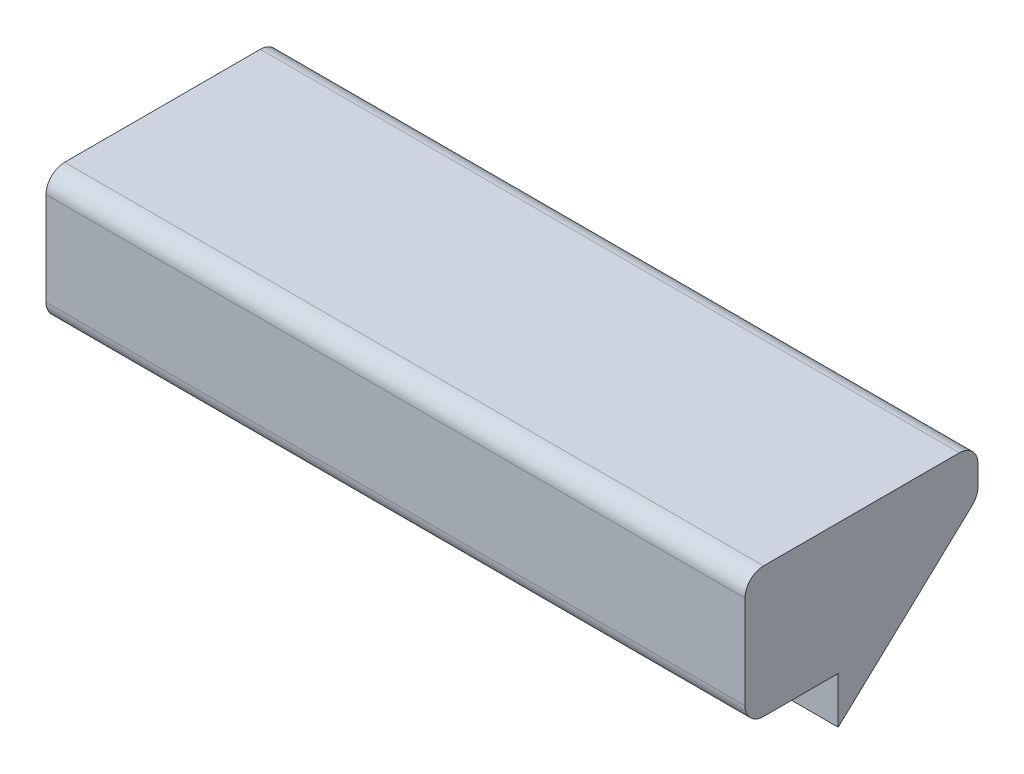
ISO-10303-21;
HEADER;
FILE_DESCRIPTION(('STEP AP214'),'2;1');
FILE_NAME('part.step','',(''),(''),'','','');
FILE_SCHEMA(('AUTOMOTIVE_DESIGN { 1 0 10303 214 1 1 1 1 }'));
ENDSEC;
DATA;
#1=APPLICATION_CONTEXT('core data for automotive mechanical design processes');
#2=APPLICATION_PROTOCOL_DEFINITION('international standard','automotive_design',2000,#1);
#3=PRODUCT_CONTEXT('',#1,'mechanical');
#4=PRODUCT('Part','Part','',(#3));
#5=PRODUCT_RELATED_PRODUCT_CATEGORY('part','',(#4));
#6=PRODUCT_DEFINITION_FORMATION('','',#4);
#7=PRODUCT_DEFINITION_CONTEXT('part definition',#1,'design');
#8=PRODUCT_DEFINITION('design','',#6,#7);
#9=PRODUCT_DEFINITION_SHAPE('','',#8);
#10=(LENGTH_UNIT() NAMED_UNIT(*) SI_UNIT(.MILLI.,.METRE.));
#11=(NAMED_UNIT(*) PLANE_ANGLE_UNIT() SI_UNIT($,.RADIAN.));
#12=(NAMED_UNIT(*) SI_UNIT($,.STERADIAN.) SOLID_ANGLE_UNIT());
#13=UNCERTAINTY_MEASURE_WITH_UNIT(LENGTH_MEASURE(1.E-05),#10,'distance_accuracy_value','');
#14=(GEOMETRIC_REPRESENTATION_CONTEXT(3) GLOBAL_UNCERTAINTY_ASSIGNED_CONTEXT((#13)) GLOBAL_UNIT_ASSIGNED_CONTEXT((#10,
#11,#12)) REPRESENTATION_CONTEXT('',''));
#15=CARTESIAN_POINT('',(0.,0.,0.));
#16=DIRECTION('',(0.,0.,1.));
#17=DIRECTION('',(1.,0.,0.));
#18=AXIS2_PLACEMENT_3D('',#15,#16,#17);
#19=CARTESIAN_POINT('',(75.,0.,-25.));
#20=DIRECTION('',(0.,-1.,0.));
#21=DIRECTION('',(0.,0.,-1.));
#22=AXIS2_PLACEMENT_3D('',#19,#20,#21);
#23=PLANE('',#22);
#24=DIRECTION('',(0.,0.,1.));
#25=VECTOR('',#24,1.);
#26=CARTESIAN_POINT('',(0.,0.,-25.));
#27=LINE('',#26,#25);
#28=CARTESIAN_POINT('',(0.,0.,-23.));
#29=VERTEX_POINT('',#28);
#30=CARTESIAN_POINT('',(0.,0.,-2.));
#31=VERTEX_POINT('',#30);
#32=EDGE_CURVE('E146',#29,#31,#27,.T.);
#33=ORIENTED_EDGE('',*,*,#32,.T.);
#34=DIRECTION('',(-1.,0.,0.));
#35=VECTOR('',#34,1.);
#36=CARTESIAN_POINT('',(75.,0.,-2.));
#37=LINE('',#36,#35);
#38=CARTESIAN_POINT('',(75.,0.,-2.));
#39=VERTEX_POINT('',#38);
#40=EDGE_CURVE('E177',#31,#39,#37,.F.);
#41=ORIENTED_EDGE('',*,*,#40,.T.);
#42=DIRECTION('',(0.,0.,1.));
#43=VECTOR('',#42,1.);
#44=CARTESIAN_POINT('',(75.,0.,-25.));
#45=LINE('',#44,#43);
#46=CARTESIAN_POINT('',(75.,0.,-23.));
#47=VERTEX_POINT('',#46);
#48=EDGE_CURVE('E160',#47,#39,#45,.T.);
#49=ORIENTED_EDGE('',*,*,#48,.F.);
#50=DIRECTION('',(-1.,0.,0.));
#51=VECTOR('',#50,1.);
#52=CARTESIAN_POINT('',(75.,0.,-23.));
#53=LINE('',#52,#51);
#54=EDGE_CURVE('E174',#47,#29,#53,.T.);
#55=ORIENTED_EDGE('',*,*,#54,.T.);
#56=EDGE_LOOP('',(#33,#41,#49,#55));
#57=FACE_BOUND('',#56,.T.);
#58=ADVANCED_FACE('F35',(#57),#23,.F.);
#59=CARTESIAN_POINT('',(75.,0.,0.));
#60=DIRECTION('',(0.,0.,-1.));
#61=DIRECTION('',(0.,1.,0.));
#62=AXIS2_PLACEMENT_3D('',#59,#60,#61);
#63=PLANE('',#62);
#64=DIRECTION('',(0.,-1.,0.));
#65=VECTOR('',#64,1.);
#66=CARTESIAN_POINT('',(75.,0.,0.));
#67=LINE('',#66,#65);
#68=CARTESIAN_POINT('',(75.,-2.,0.));
#69=VERTEX_POINT('',#68);
#70=CARTESIAN_POINT('',(75.,-12.,0.));
#71=VERTEX_POINT('',#70);
#72=EDGE_CURVE('E124',#69,#71,#67,.T.);
#73=ORIENTED_EDGE('',*,*,#72,.F.);
#74=DIRECTION('',(-1.,0.,0.));
#75=VECTOR('',#74,1.);
#76=CARTESIAN_POINT('',(75.,-2.,0.));
#77=LINE('',#76,#75);
#78=CARTESIAN_POINT('',(0.,-2.,0.));
#79=VERTEX_POINT('',#78);
#80=EDGE_CURVE('E163',#69,#79,#77,.T.);
#81=ORIENTED_EDGE('',*,*,#80,.T.);
#82=DIRECTION('',(0.,-1.,0.));
#83=VECTOR('',#82,1.);
#84=CARTESIAN_POINT('',(0.,0.,0.));
#85=LINE('',#84,#83);
#86=CARTESIAN_POINT('',(0.,-12.,0.));
#87=VERTEX_POINT('',#86);
#88=EDGE_CURVE('E149',#79,#87,#85,.T.);
#89=ORIENTED_EDGE('',*,*,#88,.T.);
#90=DIRECTION('',(-1.,0.,0.));
#91=VECTOR('',#90,1.);
#92=CARTESIAN_POINT('',(75.,-12.,0.));
#93=LINE('',#92,#91);
#94=EDGE_CURVE('E133',#87,#71,#93,.F.);
#95=ORIENTED_EDGE('',*,*,#94,.T.);
#96=EDGE_LOOP('',(#73,#81,#89,#95));
#97=FACE_BOUND('',#96,.T.);
#98=ADVANCED_FACE('F223',(#97),#63,.F.);
#99=CARTESIAN_POINT('',(75.,-14.,0.));
#100=DIRECTION('',(0.,1.,0.));
#101=DIRECTION('',(0.,0.,1.));
#102=AXIS2_PLACEMENT_3D('',#99,#100,#101);
#103=PLANE('',#102);
#104=DIRECTION('',(0.,0.,-1.));
#105=VECTOR('',#104,1.);
#106=CARTESIAN_POINT('',(75.,-14.,0.));
#107=LINE('',#106,#105);
#108=CARTESIAN_POINT('',(75.,-14.,-2.));
#109=VERTEX_POINT('',#108);
#110=CARTESIAN_POINT('',(75.,-14.,-10.));
#111=VERTEX_POINT('',#110);
#112=EDGE_CURVE('E111',#109,#111,#107,.T.);
#113=ORIENTED_EDGE('',*,*,#112,.F.);
#114=DIRECTION('',(-1.,0.,0.));
#115=VECTOR('',#114,1.);
#116=CARTESIAN_POINT('',(75.,-14.,-2.));
#117=LINE('',#116,#115);
#118=CARTESIAN_POINT('',(0.,-14.,-2.));
#119=VERTEX_POINT('',#118);
#120=EDGE_CURVE('E185',#109,#119,#117,.T.);
#121=ORIENTED_EDGE('',*,*,#120,.T.);
#122=DIRECTION('',(0.,0.,-1.));
#123=VECTOR('',#122,1.);
#124=CARTESIAN_POINT('',(0.,-14.,0.));
#125=LINE('',#124,#123);
#126=CARTESIAN_POINT('',(0.,-14.,-10.));
#127=VERTEX_POINT('',#126);
#128=EDGE_CURVE('E130',#119,#127,#125,.T.);
#129=ORIENTED_EDGE('',*,*,#128,.T.);
#130=DIRECTION('',(-1.,0.,0.));
#131=VECTOR('',#130,1.);
#132=CARTESIAN_POINT('',(75.,-14.,-10.));
#133=LINE('',#132,#131);
#134=EDGE_CURVE('E127',#111,#127,#133,.T.);
#135=ORIENTED_EDGE('',*,*,#134,.F.);
#136=EDGE_LOOP('',(#113,#121,#129,#135));
#137=FACE_BOUND('',#136,.T.);
#138=ADVANCED_FACE('F128',(#137),#103,.F.);
#139=CARTESIAN_POINT('',(75.,-14.,-10.));
#140=DIRECTION('',(0.,0.,-1.));
#141=DIRECTION('',(0.,1.,0.));
#142=AXIS2_PLACEMENT_3D('',#139,#140,#141);
#143=PLANE('',#142);
#144=DIRECTION('',(0.,-1.,0.));
#145=VECTOR('',#144,1.);
#146=CARTESIAN_POINT('',(0.,-14.,-10.));
#147=LINE('',#146,#145);
#148=CARTESIAN_POINT('',(0.,-19.,-10.));
#149=VERTEX_POINT('',#148);
#150=EDGE_CURVE('E153',#127,#149,#147,.T.);
#151=ORIENTED_EDGE('',*,*,#150,.T.);
#152=DIRECTION('',(-1.,0.,0.));
#153=VECTOR('',#152,1.);
#154=CARTESIAN_POINT('',(75.,-19.,-10.));
#155=LINE('',#154,#153);
#156=CARTESIAN_POINT('',(75.,-19.,-10.));
#157=VERTEX_POINT('',#156);
#158=EDGE_CURVE('E134',#157,#149,#155,.T.);
#159=ORIENTED_EDGE('',*,*,#158,.F.);
#160=DIRECTION('',(0.,-1.,0.));
#161=VECTOR('',#160,1.);
#162=CARTESIAN_POINT('',(75.,-14.,-10.));
#163=LINE('',#162,#161);
#164=EDGE_CURVE('E116',#111,#157,#163,.T.);
#165=ORIENTED_EDGE('',*,*,#164,.F.);
#166=ORIENTED_EDGE('',*,*,#134,.T.);
#167=EDGE_LOOP('',(#151,#159,#165,#166));
#168=FACE_BOUND('',#167,.T.);
#169=ADVANCED_FACE('F136',(#168),#143,.F.);
#170=CARTESIAN_POINT('',(75.,-19.,-10.));
#171=DIRECTION('',(0.,0.731055268242869,0.682318250360011));
#172=DIRECTION('',(0.,-0.682318250360011,0.731055268242869));
#173=AXIS2_PLACEMENT_3D('',#170,#171,#172);
#174=PLANE('',#173);
#175=DIRECTION('',(0.,0.682318250360011,-0.731055268242869));
#176=VECTOR('',#175,1.);
#177=CARTESIAN_POINT('',(0.,-19.,-10.));
#178=LINE('',#177,#176);
#179=CARTESIAN_POINT('',(0.,-5.59300593266132,-24.36463650072));
#180=VERTEX_POINT('',#179);
#181=EDGE_CURVE('E155',#149,#180,#178,.T.);
#182=ORIENTED_EDGE('',*,*,#181,.T.);
#183=DIRECTION('',(-1.,0.,0.));
#184=VECTOR('',#183,1.);
#185=CARTESIAN_POINT('',(75.,-5.59300593266132,-24.36463650072));
#186=LINE('',#185,#184);
#187=CARTESIAN_POINT('',(75.,-5.59300593266132,-24.36463650072));
#188=VERTEX_POINT('',#187);
#189=EDGE_CURVE('E11',#180,#188,#186,.F.);
#190=ORIENTED_EDGE('',*,*,#189,.T.);
#191=DIRECTION('',(0.,0.682318250360011,-0.731055268242869));
#192=VECTOR('',#191,1.);
#193=CARTESIAN_POINT('',(75.,-19.,-10.));
#194=LINE('',#193,#192);
#195=EDGE_CURVE('E139',#157,#188,#194,.T.);
#196=ORIENTED_EDGE('',*,*,#195,.F.);
#197=ORIENTED_EDGE('',*,*,#158,.T.);
#198=EDGE_LOOP('',(#182,#190,#196,#197));
#199=FACE_BOUND('',#198,.T.);
#200=ADVANCED_FACE('F212',(#199),#174,.F.);
#201=CARTESIAN_POINT('',(75.,-5.,-25.));
#202=DIRECTION('',(0.,0.,1.));
#203=DIRECTION('',(1.,0.,0.));
#204=AXIS2_PLACEMENT_3D('',#201,#202,#203);
#205=PLANE('',#204);
#206=DIRECTION('',(0.,1.,0.));
#207=VECTOR('',#206,1.);
#208=CARTESIAN_POINT('',(75.,-5.,-25.));
#209=LINE('',#208,#207);
#210=CARTESIAN_POINT('',(75.,-4.13089539617558,-25.));
#211=VERTEX_POINT('',#210);
#212=CARTESIAN_POINT('',(75.,-2.,-25.));
#213=VERTEX_POINT('',#212);
#214=EDGE_CURVE('E141',#211,#213,#209,.T.);
#215=ORIENTED_EDGE('',*,*,#214,.F.);
#216=DIRECTION('',(-1.,0.,0.));
#217=VECTOR('',#216,1.);
#218=CARTESIAN_POINT('',(75.,-4.13089539617558,-25.));
#219=LINE('',#218,#217);
#220=CARTESIAN_POINT('',(0.,-4.13089539617558,-25.));
#221=VERTEX_POINT('',#220);
#222=EDGE_CURVE('E43',#211,#221,#219,.T.);
#223=ORIENTED_EDGE('',*,*,#222,.T.);
#224=DIRECTION('',(0.,1.,0.));
#225=VECTOR('',#224,1.);
#226=CARTESIAN_POINT('',(0.,-5.,-25.));
#227=LINE('',#226,#225);
#228=CARTESIAN_POINT('',(0.,-2.,-25.));
#229=VERTEX_POINT('',#228);
#230=EDGE_CURVE('E158',#221,#229,#227,.T.);
#231=ORIENTED_EDGE('',*,*,#230,.T.);
#232=DIRECTION('',(-1.,0.,0.));
#233=VECTOR('',#232,1.);
#234=CARTESIAN_POINT('',(75.,-2.,-25.));
#235=LINE('',#234,#233);
#236=EDGE_CURVE('E50',#229,#213,#235,.F.);
#237=ORIENTED_EDGE('',*,*,#236,.T.);
#238=EDGE_LOOP('',(#215,#223,#231,#237));
#239=FACE_BOUND('',#238,.T.);
#240=ADVANCED_FACE('F190',(#239),#205,.F.);
#241=CARTESIAN_POINT('',(75.,0.,0.));
#242=DIRECTION('',(1.,0.,0.));
#243=DIRECTION('',(0.,0.,-1.));
#244=AXIS2_PLACEMENT_3D('',#241,#242,#243);
#245=PLANE('',#244);
#246=ORIENTED_EDGE('',*,*,#48,.T.);
#247=CARTESIAN_POINT('',(75.,-2.,-2.));
#248=DIRECTION('',(1.,0.,0.));
#249=DIRECTION('',(0.,0.,-1.));
#250=AXIS2_PLACEMENT_3D('',#247,#248,#249);
#251=CIRCLE('',#250,2.);
#252=EDGE_CURVE('E183',#39,#69,#251,.T.);
#253=ORIENTED_EDGE('',*,*,#252,.T.);
#254=ORIENTED_EDGE('',*,*,#72,.T.);
#255=CARTESIAN_POINT('',(75.,-12.,-2.));
#256=DIRECTION('',(1.,0.,0.));
#257=DIRECTION('',(0.,0.,-1.));
#258=AXIS2_PLACEMENT_3D('',#255,#256,#257);
#259=CIRCLE('',#258,2.);
#260=EDGE_CURVE('E120',#71,#109,#259,.T.);
#261=ORIENTED_EDGE('',*,*,#260,.T.);
#262=ORIENTED_EDGE('',*,*,#112,.T.);
#263=ORIENTED_EDGE('',*,*,#164,.T.);
#264=ORIENTED_EDGE('',*,*,#195,.T.);
#265=CARTESIAN_POINT('',(75.,-4.13089539617558,-23.));
#266=DIRECTION('',(1.,0.,0.));
#267=DIRECTION('',(0.,0.,-1.));
#268=AXIS2_PLACEMENT_3D('',#265,#266,#267);
#269=CIRCLE('',#268,2.);
#270=EDGE_CURVE('E57',#188,#211,#269,.T.);
#271=ORIENTED_EDGE('',*,*,#270,.T.);
#272=ORIENTED_EDGE('',*,*,#214,.T.);
#273=CARTESIAN_POINT('',(75.,-2.,-23.));
#274=DIRECTION('',(1.,0.,0.));
#275=DIRECTION('',(0.,0.,-1.));
#276=AXIS2_PLACEMENT_3D('',#273,#274,#275);
#277=CIRCLE('',#276,2.);
#278=EDGE_CURVE('E179',#213,#47,#277,.T.);
#279=ORIENTED_EDGE('',*,*,#278,.T.);
#280=EDGE_LOOP('',(#246,#253,#254,#261,#262,#263,#264,#271,#272,#279));
#281=FACE_BOUND('',#280,.T.);
#282=ADVANCED_FACE('F114',(#281),#245,.T.);
#283=CARTESIAN_POINT('',(0.,0.,0.));
#284=DIRECTION('',(1.,0.,0.));
#285=DIRECTION('',(0.,0.,-1.));
#286=AXIS2_PLACEMENT_3D('',#283,#284,#285);
#287=PLANE('',#286);
#288=ORIENTED_EDGE('',*,*,#88,.F.);
#289=CARTESIAN_POINT('',(0.,-2.,-2.));
#290=DIRECTION('',(1.,0.,0.));
#291=DIRECTION('',(0.,0.,-1.));
#292=AXIS2_PLACEMENT_3D('',#289,#290,#291);
#293=CIRCLE('',#292,2.);
#294=EDGE_CURVE('E172',#79,#31,#293,.F.);
#295=ORIENTED_EDGE('',*,*,#294,.T.);
#296=ORIENTED_EDGE('',*,*,#32,.F.);
#297=CARTESIAN_POINT('',(0.,-2.,-23.));
#298=DIRECTION('',(1.,0.,0.));
#299=DIRECTION('',(0.,0.,-1.));
#300=AXIS2_PLACEMENT_3D('',#297,#298,#299);
#301=CIRCLE('',#300,2.);
#302=EDGE_CURVE('E166',#29,#229,#301,.F.);
#303=ORIENTED_EDGE('',*,*,#302,.T.);
#304=ORIENTED_EDGE('',*,*,#230,.F.);
#305=CARTESIAN_POINT('',(0.,-4.13089539617558,-23.));
#306=DIRECTION('',(1.,0.,0.));
#307=DIRECTION('',(0.,0.,-1.));
#308=AXIS2_PLACEMENT_3D('',#305,#306,#307);
#309=CIRCLE('',#308,2.);
#310=EDGE_CURVE('E168',#221,#180,#309,.F.);
#311=ORIENTED_EDGE('',*,*,#310,.T.);
#312=ORIENTED_EDGE('',*,*,#181,.F.);
#313=ORIENTED_EDGE('',*,*,#150,.F.);
#314=ORIENTED_EDGE('',*,*,#128,.F.);
#315=CARTESIAN_POINT('',(0.,-12.,-2.));
#316=DIRECTION('',(1.,0.,0.));
#317=DIRECTION('',(0.,0.,-1.));
#318=AXIS2_PLACEMENT_3D('',#315,#316,#317);
#319=CIRCLE('',#318,2.);
#320=EDGE_CURVE('E170',#119,#87,#319,.F.);
#321=ORIENTED_EDGE('',*,*,#320,.T.);
#322=EDGE_LOOP('',(#288,#295,#296,#303,#304,#311,#312,#313,#314,#321));
#323=FACE_BOUND('',#322,.T.);
#324=ADVANCED_FACE('F194',(#323),#287,.F.);
#325=CARTESIAN_POINT('',(75.,-2.,-2.));
#326=DIRECTION('',(-1.,0.,0.));
#327=DIRECTION('',(0.,0.,1.));
#328=AXIS2_PLACEMENT_3D('',#325,#326,#327);
#329=CYLINDRICAL_SURFACE('',#328,2.);
#330=ORIENTED_EDGE('',*,*,#252,.F.);
#331=ORIENTED_EDGE('',*,*,#40,.F.);
#332=ORIENTED_EDGE('',*,*,#294,.F.);
#333=ORIENTED_EDGE('',*,*,#80,.F.);
#334=EDGE_LOOP('',(#330,#331,#332,#333));
#335=FACE_BOUND('',#334,.T.);
#336=ADVANCED_FACE('F220',(#335),#329,.T.);
#337=CARTESIAN_POINT('',(75.,-12.,-2.));
#338=DIRECTION('',(-1.,0.,0.));
#339=DIRECTION('',(0.,0.,1.));
#340=AXIS2_PLACEMENT_3D('',#337,#338,#339);
#341=CYLINDRICAL_SURFACE('',#340,2.);
#342=ORIENTED_EDGE('',*,*,#260,.F.);
#343=ORIENTED_EDGE('',*,*,#94,.F.);
#344=ORIENTED_EDGE('',*,*,#320,.F.);
#345=ORIENTED_EDGE('',*,*,#120,.F.);
#346=EDGE_LOOP('',(#342,#343,#344,#345));
#347=FACE_BOUND('',#346,.T.);
#348=ADVANCED_FACE('F210',(#347),#341,.T.);
#349=CARTESIAN_POINT('',(75.,-4.13089539617558,-23.));
#350=DIRECTION('',(-1.,0.,0.));
#351=DIRECTION('',(0.,0.,1.));
#352=AXIS2_PLACEMENT_3D('',#349,#350,#351);
#353=CYLINDRICAL_SURFACE('',#352,2.);
#354=ORIENTED_EDGE('',*,*,#270,.F.);
#355=ORIENTED_EDGE('',*,*,#189,.F.);
#356=ORIENTED_EDGE('',*,*,#310,.F.);
#357=ORIENTED_EDGE('',*,*,#222,.F.);
#358=EDGE_LOOP('',(#354,#355,#356,#357));
#359=FACE_BOUND('',#358,.T.);
#360=ADVANCED_FACE('F214',(#359),#353,.T.);
#361=CARTESIAN_POINT('',(75.,-2.,-23.));
#362=DIRECTION('',(-1.,0.,0.));
#363=DIRECTION('',(0.,0.,1.));
#364=AXIS2_PLACEMENT_3D('',#361,#362,#363);
#365=CYLINDRICAL_SURFACE('',#364,2.);
#366=ORIENTED_EDGE('',*,*,#278,.F.);
#367=ORIENTED_EDGE('',*,*,#236,.F.);
#368=ORIENTED_EDGE('',*,*,#302,.F.);
#369=ORIENTED_EDGE('',*,*,#54,.F.);
#370=EDGE_LOOP('',(#366,#367,#368,#369));
#371=FACE_BOUND('',#370,.T.);
#372=ADVANCED_FACE('F37',(#371),#365,.T.);
#373=CLOSED_SHELL('',(#58,#98,#138,#169,#200,#240,#282,#324,#336,#348,#360,#372));
#374=MANIFOLD_SOLID_BREP('B2',#373);
#375=ADVANCED_BREP_SHAPE_REPRESENTATION('',(#18,#374),#14);
#376=SHAPE_DEFINITION_REPRESENTATION(#9,#375);
ENDSEC;
END-ISO-10303-21;
